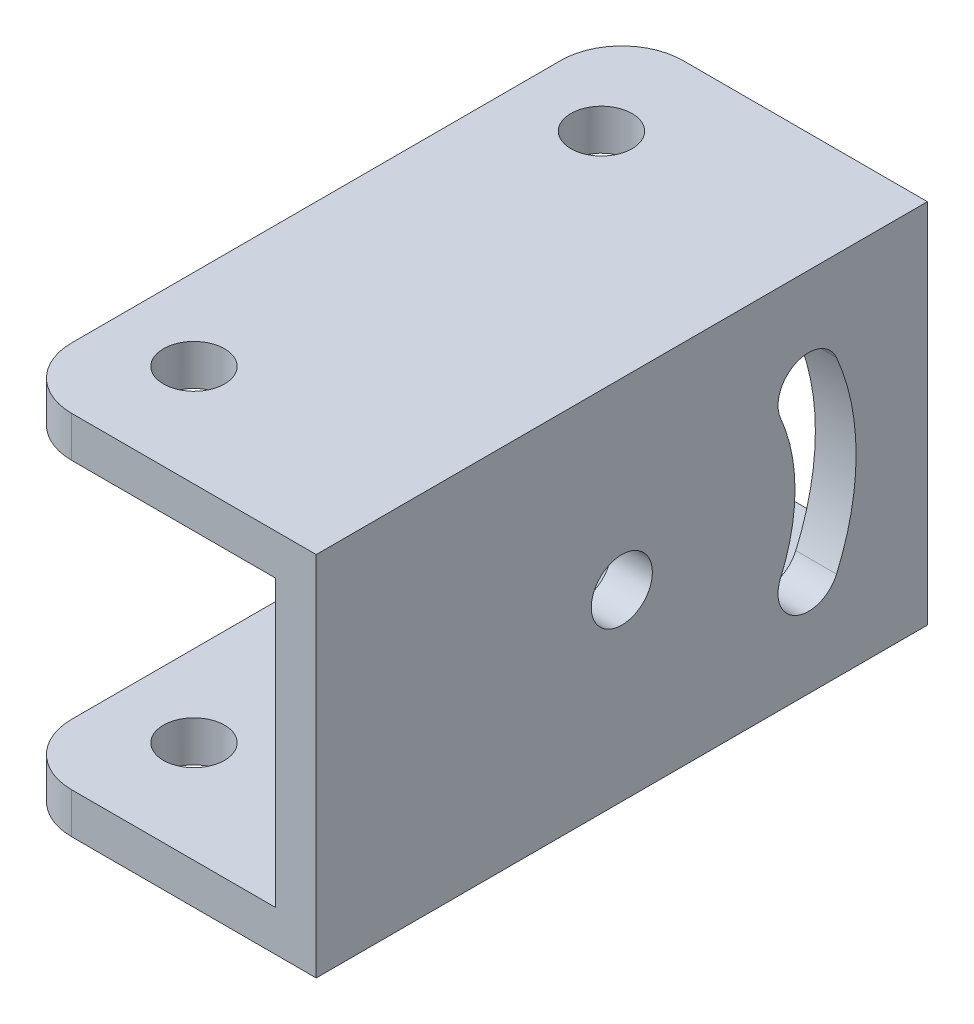
ISO-10303-21;
HEADER;
FILE_DESCRIPTION(('STEP AP214'),'2;1');
FILE_NAME('part.step','',(''),(''),'','','');
FILE_SCHEMA(('AUTOMOTIVE_DESIGN { 1 0 10303 214 1 1 1 1 }'));
ENDSEC;
DATA;
#1=APPLICATION_CONTEXT('core data for automotive mechanical design processes');
#2=APPLICATION_PROTOCOL_DEFINITION('international standard','automotive_design',2000,#1);
#3=PRODUCT_CONTEXT('',#1,'mechanical');
#4=PRODUCT('Part','Part','',(#3));
#5=PRODUCT_RELATED_PRODUCT_CATEGORY('part','',(#4));
#6=PRODUCT_DEFINITION_FORMATION('','',#4);
#7=PRODUCT_DEFINITION_CONTEXT('part definition',#1,'design');
#8=PRODUCT_DEFINITION('design','',#6,#7);
#9=PRODUCT_DEFINITION_SHAPE('','',#8);
#10=(LENGTH_UNIT() NAMED_UNIT(*) SI_UNIT(.MILLI.,.METRE.));
#11=(NAMED_UNIT(*) PLANE_ANGLE_UNIT() SI_UNIT($,.RADIAN.));
#12=(NAMED_UNIT(*) SI_UNIT($,.STERADIAN.) SOLID_ANGLE_UNIT());
#13=UNCERTAINTY_MEASURE_WITH_UNIT(LENGTH_MEASURE(1.E-05),#10,'distance_accuracy_value','');
#14=(GEOMETRIC_REPRESENTATION_CONTEXT(3) GLOBAL_UNCERTAINTY_ASSIGNED_CONTEXT((#13)) GLOBAL_UNIT_ASSIGNED_CONTEXT((#10,
#11,#12)) REPRESENTATION_CONTEXT('',''));
#15=CARTESIAN_POINT('',(0.,0.,0.));
#16=DIRECTION('',(0.,0.,1.));
#17=DIRECTION('',(1.,0.,0.));
#18=AXIS2_PLACEMENT_3D('',#15,#16,#17);
#19=CARTESIAN_POINT('',(0.,2.,30.));
#20=DIRECTION('',(1.,0.,0.));
#21=DIRECTION('',(0.,1.,0.));
#22=AXIS2_PLACEMENT_3D('',#19,#20,#21);
#23=PLANE('',#22);
#24=DIRECTION('',(0.,0.,-1.));
#25=VECTOR('',#24,1.);
#26=CARTESIAN_POINT('',(0.,0.,30.));
#27=LINE('',#26,#25);
#28=CARTESIAN_POINT('',(0.,0.,27.));
#29=VERTEX_POINT('',#28);
#30=CARTESIAN_POINT('',(0.,0.,3.));
#31=VERTEX_POINT('',#30);
#32=EDGE_CURVE('E248',#29,#31,#27,.T.);
#33=ORIENTED_EDGE('',*,*,#32,.F.);
#34=DIRECTION('',(0.,-1.,0.));
#35=VECTOR('',#34,1.);
#36=CARTESIAN_POINT('',(0.,2.,27.));
#37=LINE('',#36,#35);
#38=CARTESIAN_POINT('',(0.,2.,27.));
#39=VERTEX_POINT('',#38);
#40=EDGE_CURVE('E268',#29,#39,#37,.F.);
#41=ORIENTED_EDGE('',*,*,#40,.T.);
#42=DIRECTION('',(0.,0.,-1.));
#43=VECTOR('',#42,1.);
#44=CARTESIAN_POINT('',(0.,2.,30.));
#45=LINE('',#44,#43);
#46=CARTESIAN_POINT('',(0.,2.,3.));
#47=VERTEX_POINT('',#46);
#48=EDGE_CURVE('E215',#39,#47,#45,.T.);
#49=ORIENTED_EDGE('',*,*,#48,.T.);
#50=DIRECTION('',(0.,-1.,0.));
#51=VECTOR('',#50,1.);
#52=CARTESIAN_POINT('',(0.,2.,3.));
#53=LINE('',#52,#51);
#54=EDGE_CURVE('E265',#47,#31,#53,.T.);
#55=ORIENTED_EDGE('',*,*,#54,.T.);
#56=EDGE_LOOP('',(#33,#41,#49,#55));
#57=FACE_BOUND('',#56,.T.);
#58=ADVANCED_FACE('F34',(#57),#23,.F.);
#59=CARTESIAN_POINT('',(0.,0.,30.));
#60=DIRECTION('',(0.,1.,0.));
#61=DIRECTION('',(0.,0.,1.));
#62=AXIS2_PLACEMENT_3D('',#59,#60,#61);
#63=PLANE('',#62);
#64=CARTESIAN_POINT('',(4.,0.,4.99999999999999));
#65=DIRECTION('',(0.,1.,0.));
#66=DIRECTION('',(0.,0.,1.));
#67=AXIS2_PLACEMENT_3D('',#64,#65,#66);
#68=CIRCLE('',#67,1.5);
#69=CARTESIAN_POINT('',(4.,0.,6.49999999999999));
#70=VERTEX_POINT('',#69);
#71=EDGE_CURVE('E179',#70,#70,#68,.T.);
#72=ORIENTED_EDGE('',*,*,#71,.T.);
#73=EDGE_LOOP('',(#72));
#74=FACE_BOUND('',#73,.T.);
#75=CARTESIAN_POINT('',(4.,0.,25.));
#76=DIRECTION('',(0.,1.,0.));
#77=DIRECTION('',(0.,0.,1.));
#78=AXIS2_PLACEMENT_3D('',#75,#76,#77);
#79=CIRCLE('',#78,1.5);
#80=CARTESIAN_POINT('',(4.,0.,26.5));
#81=VERTEX_POINT('',#80);
#82=EDGE_CURVE('E190',#81,#81,#79,.T.);
#83=ORIENTED_EDGE('',*,*,#82,.T.);
#84=EDGE_LOOP('',(#83));
#85=FACE_BOUND('',#84,.T.);
#86=DIRECTION('',(1.,0.,0.));
#87=VECTOR('',#86,1.);
#88=CARTESIAN_POINT('',(0.,0.,30.));
#89=LINE('',#88,#87);
#90=CARTESIAN_POINT('',(3.,0.,30.));
#91=VERTEX_POINT('',#90);
#92=CARTESIAN_POINT('',(15.,0.,30.));
#93=VERTEX_POINT('',#92);
#94=EDGE_CURVE('E200',#91,#93,#89,.T.);
#95=ORIENTED_EDGE('',*,*,#94,.F.);
#96=CARTESIAN_POINT('',(3.,0.,27.));
#97=DIRECTION('',(0.,1.,0.));
#98=DIRECTION('',(0.,0.,1.));
#99=AXIS2_PLACEMENT_3D('',#96,#97,#98);
#100=CIRCLE('',#99,3.);
#101=EDGE_CURVE('E263',#91,#29,#100,.F.);
#102=ORIENTED_EDGE('',*,*,#101,.T.);
#103=ORIENTED_EDGE('',*,*,#32,.T.);
#104=CARTESIAN_POINT('',(3.,0.,3.));
#105=DIRECTION('',(0.,1.,0.));
#106=DIRECTION('',(0.,0.,1.));
#107=AXIS2_PLACEMENT_3D('',#104,#105,#106);
#108=CIRCLE('',#107,3.);
#109=CARTESIAN_POINT('',(3.,0.,0.));
#110=VERTEX_POINT('',#109);
#111=EDGE_CURVE('E261',#31,#110,#108,.F.);
#112=ORIENTED_EDGE('',*,*,#111,.T.);
#113=DIRECTION('',(1.,0.,0.));
#114=VECTOR('',#113,1.);
#115=CARTESIAN_POINT('',(0.,0.,0.));
#116=LINE('',#115,#114);
#117=CARTESIAN_POINT('',(15.,0.,0.));
#118=VERTEX_POINT('',#117);
#119=EDGE_CURVE('E199',#110,#118,#116,.T.);
#120=ORIENTED_EDGE('',*,*,#119,.T.);
#121=DIRECTION('',(0.,0.,-1.));
#122=VECTOR('',#121,1.);
#123=CARTESIAN_POINT('',(15.,0.,30.));
#124=LINE('',#123,#122);
#125=EDGE_CURVE('E245',#93,#118,#124,.T.);
#126=ORIENTED_EDGE('',*,*,#125,.F.);
#127=EDGE_LOOP('',(#95,#102,#103,#112,#120,#126));
#128=FACE_BOUND('',#127,.T.);
#129=ADVANCED_FACE('F315',(#74,#85,#128),#63,.F.);
#130=CARTESIAN_POINT('',(15.,0.,30.));
#131=DIRECTION('',(-1.,0.,0.));
#132=DIRECTION('',(0.,0.,1.));
#133=AXIS2_PLACEMENT_3D('',#130,#131,#132);
#134=PLANE('',#133);
#135=CARTESIAN_POINT('',(15.,9.,15.));
#136=DIRECTION('',(1.,0.,0.));
#137=DIRECTION('',(0.,0.,-1.));
#138=AXIS2_PLACEMENT_3D('',#135,#136,#137);
#139=CIRCLE('',#138,11.5);
#140=CARTESIAN_POINT('',(15.,4.4,4.46007590160157));
#141=VERTEX_POINT('',#140);
#142=CARTESIAN_POINT('',(15.,13.6,4.46007590160157));
#143=VERTEX_POINT('',#142);
#144=EDGE_CURVE('E159',#141,#143,#139,.T.);
#145=ORIENTED_EDGE('',*,*,#144,.F.);
#146=CARTESIAN_POINT('',(15.,5.,5.83484861008832));
#147=DIRECTION('',(1.,0.,0.));
#148=DIRECTION('',(0.,0.,-1.));
#149=AXIS2_PLACEMENT_3D('',#146,#147,#148);
#150=CIRCLE('',#149,1.5);
#151=CARTESIAN_POINT('',(15.,5.6,7.20962131857507));
#152=VERTEX_POINT('',#151);
#153=EDGE_CURVE('E49',#152,#141,#150,.T.);
#154=ORIENTED_EDGE('',*,*,#153,.F.);
#155=CARTESIAN_POINT('',(15.,9.,15.));
#156=DIRECTION('',(-1.,0.,0.));
#157=DIRECTION('',(0.,0.,-1.));
#158=AXIS2_PLACEMENT_3D('',#155,#156,#157);
#159=CIRCLE('',#158,8.5);
#160=CARTESIAN_POINT('',(15.,12.4,7.20962131857507));
#161=VERTEX_POINT('',#160);
#162=EDGE_CURVE('E166',#161,#152,#159,.T.);
#163=ORIENTED_EDGE('',*,*,#162,.F.);
#164=CARTESIAN_POINT('',(15.,13.,5.83484861008832));
#165=DIRECTION('',(1.,0.,0.));
#166=DIRECTION('',(0.,0.,-1.));
#167=AXIS2_PLACEMENT_3D('',#164,#165,#166);
#168=CIRCLE('',#167,1.5);
#169=EDGE_CURVE('E150',#143,#161,#168,.T.);
#170=ORIENTED_EDGE('',*,*,#169,.F.);
#171=EDGE_LOOP('',(#145,#154,#163,#170));
#172=FACE_BOUND('',#171,.T.);
#173=CARTESIAN_POINT('',(15.,9.,15.));
#174=DIRECTION('',(1.,0.,0.));
#175=DIRECTION('',(0.,0.,-1.));
#176=AXIS2_PLACEMENT_3D('',#173,#174,#175);
#177=CIRCLE('',#176,1.5);
#178=CARTESIAN_POINT('',(15.,9.,13.5));
#179=VERTEX_POINT('',#178);
#180=EDGE_CURVE('E173',#179,#179,#177,.T.);
#181=ORIENTED_EDGE('',*,*,#180,.F.);
#182=EDGE_LOOP('',(#181));
#183=FACE_BOUND('',#182,.T.);
#184=DIRECTION('',(0.,1.,0.));
#185=VECTOR('',#184,1.);
#186=CARTESIAN_POINT('',(15.,0.,0.));
#187=LINE('',#186,#185);
#188=CARTESIAN_POINT('',(15.,18.,0.));
#189=VERTEX_POINT('',#188);
#190=EDGE_CURVE('E217',#118,#189,#187,.T.);
#191=ORIENTED_EDGE('',*,*,#190,.T.);
#192=DIRECTION('',(0.,0.,-1.));
#193=VECTOR('',#192,1.);
#194=CARTESIAN_POINT('',(15.,18.,30.));
#195=LINE('',#194,#193);
#196=CARTESIAN_POINT('',(15.,18.,30.));
#197=VERTEX_POINT('',#196);
#198=EDGE_CURVE('E242',#197,#189,#195,.T.);
#199=ORIENTED_EDGE('',*,*,#198,.F.);
#200=DIRECTION('',(0.,1.,0.));
#201=VECTOR('',#200,1.);
#202=CARTESIAN_POINT('',(15.,0.,30.));
#203=LINE('',#202,#201);
#204=EDGE_CURVE('E202',#93,#197,#203,.T.);
#205=ORIENTED_EDGE('',*,*,#204,.F.);
#206=ORIENTED_EDGE('',*,*,#125,.T.);
#207=EDGE_LOOP('',(#191,#199,#205,#206));
#208=FACE_BOUND('',#207,.T.);
#209=ADVANCED_FACE('F163',(#172,#183,#208),#134,.F.);
#210=CARTESIAN_POINT('',(15.,18.,30.));
#211=DIRECTION('',(0.,-1.,0.));
#212=DIRECTION('',(0.,0.,-1.));
#213=AXIS2_PLACEMENT_3D('',#210,#211,#212);
#214=PLANE('',#213);
#215=CARTESIAN_POINT('',(4.,18.,4.99999999999999));
#216=DIRECTION('',(0.,1.,0.));
#217=DIRECTION('',(0.,0.,1.));
#218=AXIS2_PLACEMENT_3D('',#215,#216,#217);
#219=CIRCLE('',#218,1.5);
#220=CARTESIAN_POINT('',(4.,18.,6.49999999999999));
#221=VERTEX_POINT('',#220);
#222=EDGE_CURVE('E183',#221,#221,#219,.T.);
#223=ORIENTED_EDGE('',*,*,#222,.F.);
#224=EDGE_LOOP('',(#223));
#225=FACE_BOUND('',#224,.T.);
#226=CARTESIAN_POINT('',(4.,18.,25.));
#227=DIRECTION('',(0.,1.,0.));
#228=DIRECTION('',(0.,0.,1.));
#229=AXIS2_PLACEMENT_3D('',#226,#227,#228);
#230=CIRCLE('',#229,1.5);
#231=CARTESIAN_POINT('',(4.,18.,26.5));
#232=VERTEX_POINT('',#231);
#233=EDGE_CURVE('E189',#232,#232,#230,.T.);
#234=ORIENTED_EDGE('',*,*,#233,.F.);
#235=EDGE_LOOP('',(#234));
#236=FACE_BOUND('',#235,.T.);
#237=DIRECTION('',(-1.,0.,0.));
#238=VECTOR('',#237,1.);
#239=CARTESIAN_POINT('',(15.,18.,0.));
#240=LINE('',#239,#238);
#241=CARTESIAN_POINT('',(3.,18.,0.));
#242=VERTEX_POINT('',#241);
#243=EDGE_CURVE('E219',#189,#242,#240,.T.);
#244=ORIENTED_EDGE('',*,*,#243,.T.);
#245=CARTESIAN_POINT('',(3.,18.,3.));
#246=DIRECTION('',(0.,-1.,0.));
#247=DIRECTION('',(0.,0.,-1.));
#248=AXIS2_PLACEMENT_3D('',#245,#246,#247);
#249=CIRCLE('',#248,3.);
#250=CARTESIAN_POINT('',(0.,18.,3.));
#251=VERTEX_POINT('',#250);
#252=EDGE_CURVE('E289',#242,#251,#249,.F.);
#253=ORIENTED_EDGE('',*,*,#252,.T.);
#254=DIRECTION('',(0.,0.,-1.));
#255=VECTOR('',#254,1.);
#256=CARTESIAN_POINT('',(0.,18.,30.));
#257=LINE('',#256,#255);
#258=CARTESIAN_POINT('',(0.,18.,27.));
#259=VERTEX_POINT('',#258);
#260=EDGE_CURVE('E239',#259,#251,#257,.T.);
#261=ORIENTED_EDGE('',*,*,#260,.F.);
#262=CARTESIAN_POINT('',(3.,18.,27.));
#263=DIRECTION('',(0.,-1.,0.));
#264=DIRECTION('',(0.,0.,-1.));
#265=AXIS2_PLACEMENT_3D('',#262,#263,#264);
#266=CIRCLE('',#265,3.);
#267=CARTESIAN_POINT('',(3.,18.,30.));
#268=VERTEX_POINT('',#267);
#269=EDGE_CURVE('E287',#259,#268,#266,.F.);
#270=ORIENTED_EDGE('',*,*,#269,.T.);
#271=DIRECTION('',(-1.,0.,0.));
#272=VECTOR('',#271,1.);
#273=CARTESIAN_POINT('',(15.,18.,30.));
#274=LINE('',#273,#272);
#275=EDGE_CURVE('E205',#197,#268,#274,.T.);
#276=ORIENTED_EDGE('',*,*,#275,.F.);
#277=ORIENTED_EDGE('',*,*,#198,.T.);
#278=EDGE_LOOP('',(#244,#253,#261,#270,#276,#277));
#279=FACE_BOUND('',#278,.T.);
#280=ADVANCED_FACE('F346',(#225,#236,#279),#214,.F.);
#281=CARTESIAN_POINT('',(0.,18.,30.));
#282=DIRECTION('',(1.,0.,0.));
#283=DIRECTION('',(0.,1.,0.));
#284=AXIS2_PLACEMENT_3D('',#281,#282,#283);
#285=PLANE('',#284);
#286=ORIENTED_EDGE('',*,*,#260,.T.);
#287=DIRECTION('',(0.,-1.,0.));
#288=VECTOR('',#287,1.);
#289=CARTESIAN_POINT('',(0.,18.,3.));
#290=LINE('',#289,#288);
#291=CARTESIAN_POINT('',(0.,16.,3.));
#292=VERTEX_POINT('',#291);
#293=EDGE_CURVE('E280',#251,#292,#290,.T.);
#294=ORIENTED_EDGE('',*,*,#293,.T.);
#295=DIRECTION('',(0.,0.,-1.));
#296=VECTOR('',#295,1.);
#297=CARTESIAN_POINT('',(0.,16.,30.));
#298=LINE('',#297,#296);
#299=CARTESIAN_POINT('',(0.,16.,27.));
#300=VERTEX_POINT('',#299);
#301=EDGE_CURVE('E236',#300,#292,#298,.T.);
#302=ORIENTED_EDGE('',*,*,#301,.F.);
#303=DIRECTION('',(0.,-1.,0.));
#304=VECTOR('',#303,1.);
#305=CARTESIAN_POINT('',(0.,18.,27.));
#306=LINE('',#305,#304);
#307=EDGE_CURVE('E278',#300,#259,#306,.F.);
#308=ORIENTED_EDGE('',*,*,#307,.T.);
#309=EDGE_LOOP('',(#286,#294,#302,#308));
#310=FACE_BOUND('',#309,.T.);
#311=ADVANCED_FACE('F350',(#310),#285,.F.);
#312=CARTESIAN_POINT('',(0.,16.,30.));
#313=DIRECTION('',(0.,1.,0.));
#314=DIRECTION('',(-1.,0.,0.));
#315=AXIS2_PLACEMENT_3D('',#312,#313,#314);
#316=PLANE('',#315);
#317=CARTESIAN_POINT('',(4.,16.,4.99999999999999));
#318=DIRECTION('',(0.,1.,0.));
#319=DIRECTION('',(-1.,0.,0.));
#320=AXIS2_PLACEMENT_3D('',#317,#318,#319);
#321=CIRCLE('',#320,1.5);
#322=CARTESIAN_POINT('',(2.5,16.,4.99999999999999));
#323=VERTEX_POINT('',#322);
#324=EDGE_CURVE('E186',#323,#323,#321,.T.);
#325=ORIENTED_EDGE('',*,*,#324,.T.);
#326=EDGE_LOOP('',(#325));
#327=FACE_BOUND('',#326,.T.);
#328=CARTESIAN_POINT('',(4.,16.,25.));
#329=DIRECTION('',(0.,1.,0.));
#330=DIRECTION('',(-1.,0.,0.));
#331=AXIS2_PLACEMENT_3D('',#328,#329,#330);
#332=CIRCLE('',#331,1.5);
#333=CARTESIAN_POINT('',(2.5,16.,25.));
#334=VERTEX_POINT('',#333);
#335=EDGE_CURVE('E196',#334,#334,#332,.T.);
#336=ORIENTED_EDGE('',*,*,#335,.T.);
#337=EDGE_LOOP('',(#336));
#338=FACE_BOUND('',#337,.T.);
#339=ORIENTED_EDGE('',*,*,#301,.T.);
#340=CARTESIAN_POINT('',(3.,16.,3.));
#341=DIRECTION('',(0.,1.,0.));
#342=DIRECTION('',(-1.,0.,0.));
#343=AXIS2_PLACEMENT_3D('',#340,#341,#342);
#344=CIRCLE('',#343,3.);
#345=CARTESIAN_POINT('',(3.,16.,0.));
#346=VERTEX_POINT('',#345);
#347=EDGE_CURVE('E285',#292,#346,#344,.F.);
#348=ORIENTED_EDGE('',*,*,#347,.T.);
#349=DIRECTION('',(1.,0.,0.));
#350=VECTOR('',#349,1.);
#351=CARTESIAN_POINT('',(0.,16.,0.));
#352=LINE('',#351,#350);
#353=CARTESIAN_POINT('',(13.,16.,0.));
#354=VERTEX_POINT('',#353);
#355=EDGE_CURVE('E222',#346,#354,#352,.T.);
#356=ORIENTED_EDGE('',*,*,#355,.T.);
#357=DIRECTION('',(0.,0.,-1.));
#358=VECTOR('',#357,1.);
#359=CARTESIAN_POINT('',(13.,16.,30.));
#360=LINE('',#359,#358);
#361=CARTESIAN_POINT('',(13.,16.,30.));
#362=VERTEX_POINT('',#361);
#363=EDGE_CURVE('E233',#362,#354,#360,.T.);
#364=ORIENTED_EDGE('',*,*,#363,.F.);
#365=DIRECTION('',(1.,0.,0.));
#366=VECTOR('',#365,1.);
#367=CARTESIAN_POINT('',(0.,16.,30.));
#368=LINE('',#367,#366);
#369=CARTESIAN_POINT('',(3.,16.,30.));
#370=VERTEX_POINT('',#369);
#371=EDGE_CURVE('E208',#370,#362,#368,.T.);
#372=ORIENTED_EDGE('',*,*,#371,.F.);
#373=CARTESIAN_POINT('',(3.,16.,27.));
#374=DIRECTION('',(0.,1.,0.));
#375=DIRECTION('',(-1.,0.,0.));
#376=AXIS2_PLACEMENT_3D('',#373,#374,#375);
#377=CIRCLE('',#376,3.);
#378=EDGE_CURVE('E283',#370,#300,#377,.F.);
#379=ORIENTED_EDGE('',*,*,#378,.T.);
#380=EDGE_LOOP('',(#339,#348,#356,#364,#372,#379));
#381=FACE_BOUND('',#380,.T.);
#382=ADVANCED_FACE('F372',(#327,#338,#381),#316,.F.);
#383=CARTESIAN_POINT('',(13.,16.,30.));
#384=DIRECTION('',(1.,0.,0.));
#385=DIRECTION('',(0.,1.,0.));
#386=AXIS2_PLACEMENT_3D('',#383,#384,#385);
#387=PLANE('',#386);
#388=CARTESIAN_POINT('',(13.,9.,15.));
#389=DIRECTION('',(1.,0.,0.));
#390=DIRECTION('',(0.,1.,0.));
#391=AXIS2_PLACEMENT_3D('',#388,#389,#390);
#392=CIRCLE('',#391,8.5);
#393=CARTESIAN_POINT('',(13.,12.4,7.20962131857507));
#394=VERTEX_POINT('',#393);
#395=CARTESIAN_POINT('',(13.,5.6,7.20962131857507));
#396=VERTEX_POINT('',#395);
#397=EDGE_CURVE('E42',#394,#396,#392,.F.);
#398=ORIENTED_EDGE('',*,*,#397,.T.);
#399=CARTESIAN_POINT('',(13.,5.,5.83484861008832));
#400=DIRECTION('',(1.,0.,0.));
#401=DIRECTION('',(0.,1.,0.));
#402=AXIS2_PLACEMENT_3D('',#399,#400,#401);
#403=CIRCLE('',#402,1.5);
#404=CARTESIAN_POINT('',(13.,4.4,4.46007590160157));
#405=VERTEX_POINT('',#404);
#406=EDGE_CURVE('E11',#396,#405,#403,.T.);
#407=ORIENTED_EDGE('',*,*,#406,.T.);
#408=CARTESIAN_POINT('',(13.,9.,15.));
#409=DIRECTION('',(1.,0.,0.));
#410=DIRECTION('',(0.,1.,0.));
#411=AXIS2_PLACEMENT_3D('',#408,#409,#410);
#412=CIRCLE('',#411,11.5);
#413=CARTESIAN_POINT('',(13.,13.6,4.46007590160157));
#414=VERTEX_POINT('',#413);
#415=EDGE_CURVE('E291',#405,#414,#412,.T.);
#416=ORIENTED_EDGE('',*,*,#415,.T.);
#417=CARTESIAN_POINT('',(13.,13.,5.83484861008832));
#418=DIRECTION('',(1.,0.,0.));
#419=DIRECTION('',(0.,1.,0.));
#420=AXIS2_PLACEMENT_3D('',#417,#418,#419);
#421=CIRCLE('',#420,1.5);
#422=EDGE_CURVE('E153',#414,#394,#421,.T.);
#423=ORIENTED_EDGE('',*,*,#422,.T.);
#424=EDGE_LOOP('',(#398,#407,#416,#423));
#425=FACE_BOUND('',#424,.T.);
#426=CARTESIAN_POINT('',(13.,9.,15.));
#427=DIRECTION('',(1.,0.,0.));
#428=DIRECTION('',(0.,1.,0.));
#429=AXIS2_PLACEMENT_3D('',#426,#427,#428);
#430=CIRCLE('',#429,1.5);
#431=CARTESIAN_POINT('',(13.,10.5,15.));
#432=VERTEX_POINT('',#431);
#433=EDGE_CURVE('E178',#432,#432,#430,.T.);
#434=ORIENTED_EDGE('',*,*,#433,.T.);
#435=EDGE_LOOP('',(#434));
#436=FACE_BOUND('',#435,.T.);
#437=DIRECTION('',(0.,-1.,0.));
#438=VECTOR('',#437,1.);
#439=CARTESIAN_POINT('',(13.,16.,0.));
#440=LINE('',#439,#438);
#441=CARTESIAN_POINT('',(13.,2.,0.));
#442=VERTEX_POINT('',#441);
#443=EDGE_CURVE('E224',#354,#442,#440,.T.);
#444=ORIENTED_EDGE('',*,*,#443,.T.);
#445=DIRECTION('',(0.,0.,-1.));
#446=VECTOR('',#445,1.);
#447=CARTESIAN_POINT('',(13.,2.,30.));
#448=LINE('',#447,#446);
#449=CARTESIAN_POINT('',(13.,2.,30.));
#450=VERTEX_POINT('',#449);
#451=EDGE_CURVE('E230',#450,#442,#448,.T.);
#452=ORIENTED_EDGE('',*,*,#451,.F.);
#453=DIRECTION('',(0.,-1.,0.));
#454=VECTOR('',#453,1.);
#455=CARTESIAN_POINT('',(13.,16.,30.));
#456=LINE('',#455,#454);
#457=EDGE_CURVE('E210',#362,#450,#456,.T.);
#458=ORIENTED_EDGE('',*,*,#457,.F.);
#459=ORIENTED_EDGE('',*,*,#363,.T.);
#460=EDGE_LOOP('',(#444,#452,#458,#459));
#461=FACE_BOUND('',#460,.T.);
#462=ADVANCED_FACE('F297',(#425,#436,#461),#387,.F.);
#463=CARTESIAN_POINT('',(13.,2.,30.));
#464=DIRECTION('',(0.,-1.,0.));
#465=DIRECTION('',(1.,0.,0.));
#466=AXIS2_PLACEMENT_3D('',#463,#464,#465);
#467=PLANE('',#466);
#468=CARTESIAN_POINT('',(4.,2.,4.99999999999999));
#469=DIRECTION('',(0.,-1.,0.));
#470=DIRECTION('',(1.,0.,0.));
#471=AXIS2_PLACEMENT_3D('',#468,#469,#470);
#472=CIRCLE('',#471,1.5);
#473=CARTESIAN_POINT('',(5.5,2.,4.99999999999999));
#474=VERTEX_POINT('',#473);
#475=EDGE_CURVE('E182',#474,#474,#472,.T.);
#476=ORIENTED_EDGE('',*,*,#475,.T.);
#477=EDGE_LOOP('',(#476));
#478=FACE_BOUND('',#477,.T.);
#479=CARTESIAN_POINT('',(4.,2.,25.));
#480=DIRECTION('',(0.,-1.,0.));
#481=DIRECTION('',(1.,0.,0.));
#482=AXIS2_PLACEMENT_3D('',#479,#480,#481);
#483=CIRCLE('',#482,1.5);
#484=CARTESIAN_POINT('',(5.5,2.,25.));
#485=VERTEX_POINT('',#484);
#486=EDGE_CURVE('E193',#485,#485,#483,.T.);
#487=ORIENTED_EDGE('',*,*,#486,.T.);
#488=EDGE_LOOP('',(#487));
#489=FACE_BOUND('',#488,.T.);
#490=ORIENTED_EDGE('',*,*,#48,.F.);
#491=CARTESIAN_POINT('',(3.,2.,27.));
#492=DIRECTION('',(0.,-1.,0.));
#493=DIRECTION('',(1.,0.,0.));
#494=AXIS2_PLACEMENT_3D('',#491,#492,#493);
#495=CIRCLE('',#494,3.);
#496=CARTESIAN_POINT('',(3.,2.,30.));
#497=VERTEX_POINT('',#496);
#498=EDGE_CURVE('E272',#39,#497,#495,.F.);
#499=ORIENTED_EDGE('',*,*,#498,.T.);
#500=DIRECTION('',(-1.,0.,0.));
#501=VECTOR('',#500,1.);
#502=CARTESIAN_POINT('',(13.,2.,30.));
#503=LINE('',#502,#501);
#504=EDGE_CURVE('E212',#450,#497,#503,.T.);
#505=ORIENTED_EDGE('',*,*,#504,.F.);
#506=ORIENTED_EDGE('',*,*,#451,.T.);
#507=DIRECTION('',(-1.,0.,0.));
#508=VECTOR('',#507,1.);
#509=CARTESIAN_POINT('',(13.,2.,0.));
#510=LINE('',#509,#508);
#511=CARTESIAN_POINT('',(3.,2.,0.));
#512=VERTEX_POINT('',#511);
#513=EDGE_CURVE('E203',#442,#512,#510,.T.);
#514=ORIENTED_EDGE('',*,*,#513,.T.);
#515=CARTESIAN_POINT('',(3.,2.,3.));
#516=DIRECTION('',(0.,-1.,0.));
#517=DIRECTION('',(1.,0.,0.));
#518=AXIS2_PLACEMENT_3D('',#515,#516,#517);
#519=CIRCLE('',#518,3.);
#520=EDGE_CURVE('E270',#512,#47,#519,.F.);
#521=ORIENTED_EDGE('',*,*,#520,.T.);
#522=EDGE_LOOP('',(#490,#499,#505,#506,#514,#521));
#523=FACE_BOUND('',#522,.T.);
#524=ADVANCED_FACE('F386',(#478,#489,#523),#467,.F.);
#525=CARTESIAN_POINT('',(0.,0.,30.));
#526=DIRECTION('',(0.,0.,1.));
#527=DIRECTION('',(1.,0.,0.));
#528=AXIS2_PLACEMENT_3D('',#525,#526,#527);
#529=PLANE('',#528);
#530=ORIENTED_EDGE('',*,*,#504,.T.);
#531=DIRECTION('',(0.,-1.,0.));
#532=VECTOR('',#531,1.);
#533=CARTESIAN_POINT('',(3.,0.,30.));
#534=LINE('',#533,#532);
#535=EDGE_CURVE('E258',#497,#91,#534,.T.);
#536=ORIENTED_EDGE('',*,*,#535,.T.);
#537=ORIENTED_EDGE('',*,*,#94,.T.);
#538=ORIENTED_EDGE('',*,*,#204,.T.);
#539=ORIENTED_EDGE('',*,*,#275,.T.);
#540=DIRECTION('',(0.,-1.,0.));
#541=VECTOR('',#540,1.);
#542=CARTESIAN_POINT('',(3.,16.,30.));
#543=LINE('',#542,#541);
#544=EDGE_CURVE('E251',#268,#370,#543,.T.);
#545=ORIENTED_EDGE('',*,*,#544,.T.);
#546=ORIENTED_EDGE('',*,*,#371,.T.);
#547=ORIENTED_EDGE('',*,*,#457,.T.);
#548=EDGE_LOOP('',(#530,#536,#537,#538,#539,#545,#546,#547));
#549=FACE_BOUND('',#548,.T.);
#550=ADVANCED_FACE('F356',(#549),#529,.T.);
#551=CARTESIAN_POINT('',(0.,0.,0.));
#552=DIRECTION('',(0.,0.,1.));
#553=DIRECTION('',(1.,0.,0.));
#554=AXIS2_PLACEMENT_3D('',#551,#552,#553);
#555=PLANE('',#554);
#556=ORIENTED_EDGE('',*,*,#119,.F.);
#557=DIRECTION('',(0.,-1.,0.));
#558=VECTOR('',#557,1.);
#559=CARTESIAN_POINT('',(3.,0.,0.));
#560=LINE('',#559,#558);
#561=EDGE_CURVE('E276',#110,#512,#560,.F.);
#562=ORIENTED_EDGE('',*,*,#561,.T.);
#563=ORIENTED_EDGE('',*,*,#513,.F.);
#564=ORIENTED_EDGE('',*,*,#443,.F.);
#565=ORIENTED_EDGE('',*,*,#355,.F.);
#566=DIRECTION('',(0.,-1.,0.));
#567=VECTOR('',#566,1.);
#568=CARTESIAN_POINT('',(3.,0.,0.));
#569=LINE('',#568,#567);
#570=EDGE_CURVE('E274',#346,#242,#569,.F.);
#571=ORIENTED_EDGE('',*,*,#570,.T.);
#572=ORIENTED_EDGE('',*,*,#243,.F.);
#573=ORIENTED_EDGE('',*,*,#190,.F.);
#574=EDGE_LOOP('',(#556,#562,#563,#564,#565,#571,#572,#573));
#575=FACE_BOUND('',#574,.T.);
#576=ADVANCED_FACE('F366',(#575),#555,.F.);
#577=CARTESIAN_POINT('',(4.,0.,25.));
#578=DIRECTION('',(0.,1.,0.));
#579=DIRECTION('',(0.,0.,1.));
#580=AXIS2_PLACEMENT_3D('',#577,#578,#579);
#581=CYLINDRICAL_SURFACE('',#580,1.5);
#582=ORIENTED_EDGE('',*,*,#82,.F.);
#583=EDGE_LOOP('',(#582));
#584=FACE_BOUND('',#583,.T.);
#585=ORIENTED_EDGE('',*,*,#486,.F.);
#586=EDGE_LOOP('',(#585));
#587=FACE_BOUND('',#586,.T.);
#588=ADVANCED_FACE('F492',(#584,#587),#581,.F.);
#589=ORIENTED_EDGE('',*,*,#233,.T.);
#590=EDGE_LOOP('',(#589));
#591=FACE_BOUND('',#590,.T.);
#592=ORIENTED_EDGE('',*,*,#335,.F.);
#593=EDGE_LOOP('',(#592));
#594=FACE_BOUND('',#593,.T.);
#595=ADVANCED_FACE('F509',(#591,#594),#581,.F.);
#596=CARTESIAN_POINT('',(4.,0.,4.99999999999999));
#597=DIRECTION('',(0.,1.,0.));
#598=DIRECTION('',(0.,0.,1.));
#599=AXIS2_PLACEMENT_3D('',#596,#597,#598);
#600=CYLINDRICAL_SURFACE('',#599,1.5);
#601=ORIENTED_EDGE('',*,*,#71,.F.);
#602=EDGE_LOOP('',(#601));
#603=FACE_BOUND('',#602,.T.);
#604=ORIENTED_EDGE('',*,*,#475,.F.);
#605=EDGE_LOOP('',(#604));
#606=FACE_BOUND('',#605,.T.);
#607=ADVANCED_FACE('F516',(#603,#606),#600,.F.);
#608=ORIENTED_EDGE('',*,*,#222,.T.);
#609=EDGE_LOOP('',(#608));
#610=FACE_BOUND('',#609,.T.);
#611=ORIENTED_EDGE('',*,*,#324,.F.);
#612=EDGE_LOOP('',(#611));
#613=FACE_BOUND('',#612,.T.);
#614=ADVANCED_FACE('F330',(#610,#613),#600,.F.);
#615=CARTESIAN_POINT('',(3.,0.,27.));
#616=DIRECTION('',(0.,1.,0.));
#617=DIRECTION('',(-1.,0.,0.));
#618=AXIS2_PLACEMENT_3D('',#615,#616,#617);
#619=CYLINDRICAL_SURFACE('',#618,3.);
#620=ORIENTED_EDGE('',*,*,#498,.F.);
#621=ORIENTED_EDGE('',*,*,#40,.F.);
#622=ORIENTED_EDGE('',*,*,#101,.F.);
#623=ORIENTED_EDGE('',*,*,#535,.F.);
#624=EDGE_LOOP('',(#620,#621,#622,#623));
#625=FACE_BOUND('',#624,.T.);
#626=ADVANCED_FACE('F326',(#625),#619,.T.);
#627=CARTESIAN_POINT('',(3.,2.,3.));
#628=DIRECTION('',(0.,-1.,0.));
#629=DIRECTION('',(1.,0.,0.));
#630=AXIS2_PLACEMENT_3D('',#627,#628,#629);
#631=CYLINDRICAL_SURFACE('',#630,3.);
#632=ORIENTED_EDGE('',*,*,#520,.F.);
#633=ORIENTED_EDGE('',*,*,#561,.F.);
#634=ORIENTED_EDGE('',*,*,#111,.F.);
#635=ORIENTED_EDGE('',*,*,#54,.F.);
#636=EDGE_LOOP('',(#632,#633,#634,#635));
#637=FACE_BOUND('',#636,.T.);
#638=ADVANCED_FACE('F329',(#637),#631,.T.);
#639=CARTESIAN_POINT('',(3.,18.,3.));
#640=DIRECTION('',(0.,-1.,0.));
#641=DIRECTION('',(1.,0.,0.));
#642=AXIS2_PLACEMENT_3D('',#639,#640,#641);
#643=CYLINDRICAL_SURFACE('',#642,3.);
#644=ORIENTED_EDGE('',*,*,#252,.F.);
#645=ORIENTED_EDGE('',*,*,#570,.F.);
#646=ORIENTED_EDGE('',*,*,#347,.F.);
#647=ORIENTED_EDGE('',*,*,#293,.F.);
#648=EDGE_LOOP('',(#644,#645,#646,#647));
#649=FACE_BOUND('',#648,.T.);
#650=ADVANCED_FACE('F333',(#649),#643,.T.);
#651=CARTESIAN_POINT('',(3.,0.,27.));
#652=DIRECTION('',(0.,1.,0.));
#653=DIRECTION('',(-1.,0.,0.));
#654=AXIS2_PLACEMENT_3D('',#651,#652,#653);
#655=CYLINDRICAL_SURFACE('',#654,3.);
#656=ORIENTED_EDGE('',*,*,#269,.F.);
#657=ORIENTED_EDGE('',*,*,#307,.F.);
#658=ORIENTED_EDGE('',*,*,#378,.F.);
#659=ORIENTED_EDGE('',*,*,#544,.F.);
#660=EDGE_LOOP('',(#656,#657,#658,#659));
#661=FACE_BOUND('',#660,.T.);
#662=ADVANCED_FACE('F36',(#661),#655,.T.);
#663=CARTESIAN_POINT('',(-15.,9.,15.));
#664=DIRECTION('',(1.,0.,0.));
#665=DIRECTION('',(0.,0.,-1.));
#666=AXIS2_PLACEMENT_3D('',#663,#664,#665);
#667=CYLINDRICAL_SURFACE('',#666,1.5);
#668=ORIENTED_EDGE('',*,*,#180,.T.);
#669=EDGE_LOOP('',(#668));
#670=FACE_BOUND('',#669,.T.);
#671=ORIENTED_EDGE('',*,*,#433,.F.);
#672=EDGE_LOOP('',(#671));
#673=FACE_BOUND('',#672,.T.);
#674=ADVANCED_FACE('F304',(#670,#673),#667,.F.);
#675=CARTESIAN_POINT('',(-15.,5.,5.83484861008832));
#676=DIRECTION('',(1.,0.,0.));
#677=DIRECTION('',(0.,0.,-1.));
#678=AXIS2_PLACEMENT_3D('',#675,#676,#677);
#679=CYLINDRICAL_SURFACE('',#678,1.5);
#680=DIRECTION('',(1.,0.,0.));
#681=VECTOR('',#680,1.);
#682=CARTESIAN_POINT('',(-15.,5.6,7.20962131857507));
#683=LINE('',#682,#681);
#684=EDGE_CURVE('E171',#396,#152,#683,.T.);
#685=ORIENTED_EDGE('',*,*,#684,.T.);
#686=ORIENTED_EDGE('',*,*,#153,.T.);
#687=DIRECTION('',(1.,0.,0.));
#688=VECTOR('',#687,1.);
#689=CARTESIAN_POINT('',(-15.,4.4,4.46007590160157));
#690=LINE('',#689,#688);
#691=EDGE_CURVE('E156',#405,#141,#690,.T.);
#692=ORIENTED_EDGE('',*,*,#691,.F.);
#693=ORIENTED_EDGE('',*,*,#406,.F.);
#694=EDGE_LOOP('',(#685,#686,#692,#693));
#695=FACE_BOUND('',#694,.T.);
#696=ADVANCED_FACE('F302',(#695),#679,.F.);
#697=CARTESIAN_POINT('',(-15.,9.,15.));
#698=DIRECTION('',(1.,0.,0.));
#699=DIRECTION('',(0.,0.,-1.));
#700=AXIS2_PLACEMENT_3D('',#697,#698,#699);
#701=CYLINDRICAL_SURFACE('',#700,8.5);
#702=DIRECTION('',(1.,0.,0.));
#703=VECTOR('',#702,1.);
#704=CARTESIAN_POINT('',(-15.,12.4,7.20962131857507));
#705=LINE('',#704,#703);
#706=EDGE_CURVE('E155',#394,#161,#705,.T.);
#707=ORIENTED_EDGE('',*,*,#706,.T.);
#708=ORIENTED_EDGE('',*,*,#162,.T.);
#709=ORIENTED_EDGE('',*,*,#684,.F.);
#710=ORIENTED_EDGE('',*,*,#397,.F.);
#711=EDGE_LOOP('',(#707,#708,#709,#710));
#712=FACE_BOUND('',#711,.T.);
#713=ADVANCED_FACE('F301',(#712),#701,.T.);
#714=CARTESIAN_POINT('',(-15.,13.,5.83484861008832));
#715=DIRECTION('',(1.,0.,0.));
#716=DIRECTION('',(0.,0.,-1.));
#717=AXIS2_PLACEMENT_3D('',#714,#715,#716);
#718=CYLINDRICAL_SURFACE('',#717,1.5);
#719=DIRECTION('',(1.,0.,0.));
#720=VECTOR('',#719,1.);
#721=CARTESIAN_POINT('',(-15.,13.6,4.46007590160157));
#722=LINE('',#721,#720);
#723=EDGE_CURVE('E57',#414,#143,#722,.T.);
#724=ORIENTED_EDGE('',*,*,#723,.T.);
#725=ORIENTED_EDGE('',*,*,#169,.T.);
#726=ORIENTED_EDGE('',*,*,#706,.F.);
#727=ORIENTED_EDGE('',*,*,#422,.F.);
#728=EDGE_LOOP('',(#724,#725,#726,#727));
#729=FACE_BOUND('',#728,.T.);
#730=ADVANCED_FACE('F147',(#729),#718,.F.);
#731=CARTESIAN_POINT('',(-15.,9.,15.));
#732=DIRECTION('',(1.,0.,0.));
#733=DIRECTION('',(0.,0.,-1.));
#734=AXIS2_PLACEMENT_3D('',#731,#732,#733);
#735=CYLINDRICAL_SURFACE('',#734,11.5);
#736=ORIENTED_EDGE('',*,*,#691,.T.);
#737=ORIENTED_EDGE('',*,*,#144,.T.);
#738=ORIENTED_EDGE('',*,*,#723,.F.);
#739=ORIENTED_EDGE('',*,*,#415,.F.);
#740=EDGE_LOOP('',(#736,#737,#738,#739));
#741=FACE_BOUND('',#740,.T.);
#742=ADVANCED_FACE('F160',(#741),#735,.F.);
#743=CLOSED_SHELL('',(#58,#129,#209,#280,#311,#382,#462,#524,#550,#576,#588,#595,#607,#614,#626,
#638,#650,#662,#674,#696,#713,#730,#742));
#744=MANIFOLD_SOLID_BREP('B2',#743);
#745=ADVANCED_BREP_SHAPE_REPRESENTATION('',(#18,#744),#14);
#746=SHAPE_DEFINITION_REPRESENTATION(#9,#745);
ENDSEC;
END-ISO-10303-21;
